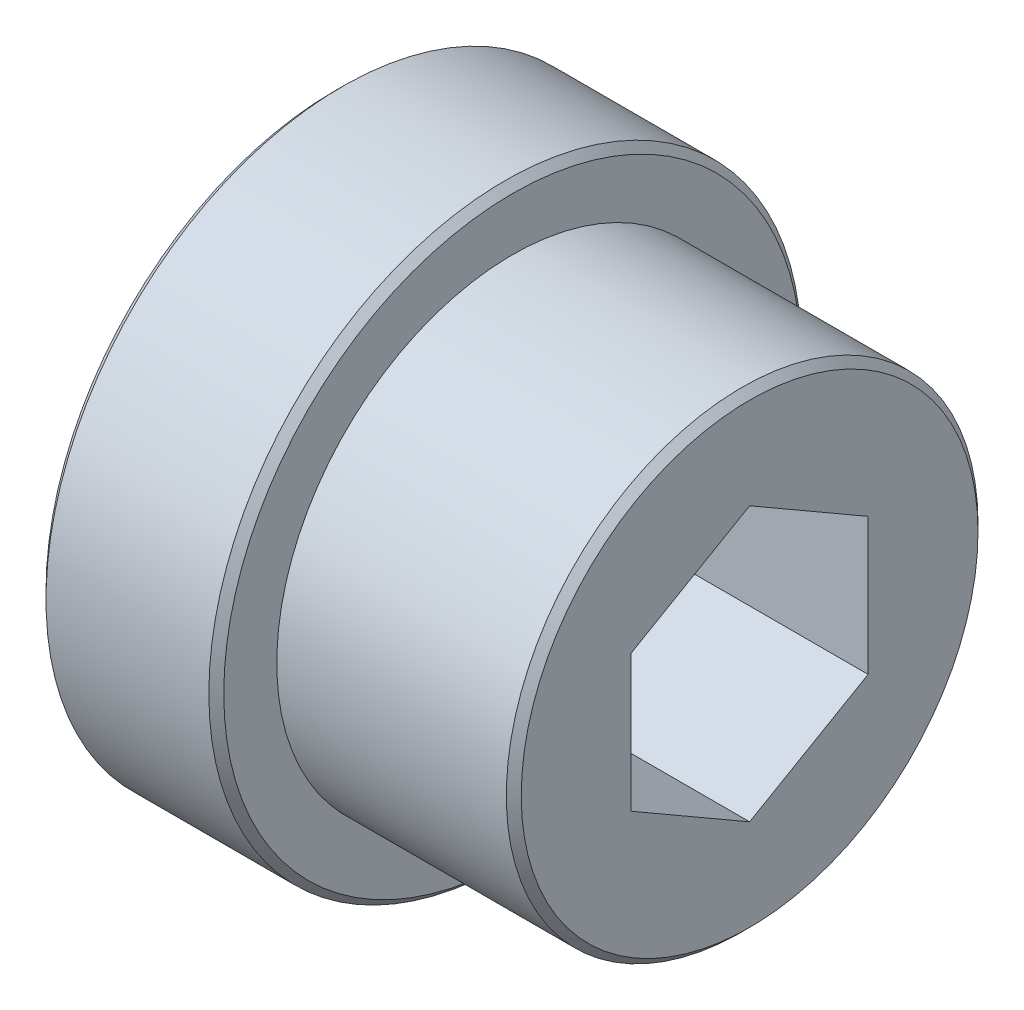
ISO-10303-21;
HEADER;
FILE_DESCRIPTION(('STEP AP214'),'2;1');
FILE_NAME('part.step','',(''),(''),'','','');
FILE_SCHEMA(('AUTOMOTIVE_DESIGN { 1 0 10303 214 1 1 1 1 }'));
ENDSEC;
DATA;
#1=APPLICATION_CONTEXT('core data for automotive mechanical design processes');
#2=APPLICATION_PROTOCOL_DEFINITION('international standard','automotive_design',2000,#1);
#3=PRODUCT_CONTEXT('',#1,'mechanical');
#4=PRODUCT('Part','Part','',(#3));
#5=PRODUCT_RELATED_PRODUCT_CATEGORY('part','',(#4));
#6=PRODUCT_DEFINITION_FORMATION('','',#4);
#7=PRODUCT_DEFINITION_CONTEXT('part definition',#1,'design');
#8=PRODUCT_DEFINITION('design','',#6,#7);
#9=PRODUCT_DEFINITION_SHAPE('','',#8);
#10=(LENGTH_UNIT() NAMED_UNIT(*) SI_UNIT(.MILLI.,.METRE.));
#11=(NAMED_UNIT(*) PLANE_ANGLE_UNIT() SI_UNIT($,.RADIAN.));
#12=(NAMED_UNIT(*) SI_UNIT($,.STERADIAN.) SOLID_ANGLE_UNIT());
#13=UNCERTAINTY_MEASURE_WITH_UNIT(LENGTH_MEASURE(1.E-05),#10,'distance_accuracy_value','');
#14=(GEOMETRIC_REPRESENTATION_CONTEXT(3) GLOBAL_UNCERTAINTY_ASSIGNED_CONTEXT((#13)) GLOBAL_UNIT_ASSIGNED_CONTEXT((#10,
#11,#12)) REPRESENTATION_CONTEXT('',''));
#15=CARTESIAN_POINT('',(0.,0.,0.));
#16=DIRECTION('',(0.,0.,1.));
#17=DIRECTION('',(1.,0.,0.));
#18=AXIS2_PLACEMENT_3D('',#15,#16,#17);
#19=CARTESIAN_POINT('',(12.7,0.,0.));
#20=DIRECTION('',(-1.,0.,0.));
#21=DIRECTION('',(0.,0.,1.));
#22=AXIS2_PLACEMENT_3D('',#19,#20,#21);
#23=CYLINDRICAL_SURFACE('',#22,12.6365);
#24=CARTESIAN_POINT('',(12.3,0.,0.));
#25=DIRECTION('',(1.,0.,0.));
#26=DIRECTION('',(0.,0.,-1.));
#27=AXIS2_PLACEMENT_3D('',#24,#25,#26);
#28=CIRCLE('',#27,12.6365);
#29=CARTESIAN_POINT('',(12.3,0.,-12.6365));
#30=VERTEX_POINT('',#29);
#31=EDGE_CURVE('E11',#30,#30,#28,.F.);
#32=ORIENTED_EDGE('',*,*,#31,.T.);
#33=EDGE_LOOP('',(#32));
#34=FACE_BOUND('',#33,.T.);
#35=CARTESIAN_POINT('',(0.,0.,0.));
#36=DIRECTION('',(1.,0.,0.));
#37=DIRECTION('',(0.,0.,-1.));
#38=AXIS2_PLACEMENT_3D('',#35,#36,#37);
#39=CIRCLE('',#38,12.6365);
#40=CARTESIAN_POINT('',(0.,0.,-12.6365));
#41=VERTEX_POINT('',#40);
#42=EDGE_CURVE('E138',#41,#41,#39,.T.);
#43=ORIENTED_EDGE('',*,*,#42,.T.);
#44=EDGE_LOOP('',(#43));
#45=FACE_BOUND('',#44,.T.);
#46=ADVANCED_FACE('F39',(#34,#45),#23,.T.);
#47=CARTESIAN_POINT('',(12.7,0.,0.));
#48=DIRECTION('',(1.,0.,0.));
#49=DIRECTION('',(0.,0.,-1.));
#50=AXIS2_PLACEMENT_3D('',#47,#48,#49);
#51=PLANE('',#50);
#52=DIRECTION('',(0.,0.5,-0.866025403784439));
#53=VECTOR('',#52,1.);
#54=CARTESIAN_POINT('',(12.7,3.66617420935413,6.34999999999999));
#55=LINE('',#54,#53);
#56=CARTESIAN_POINT('',(12.7,3.66617420935413,6.34999999999999));
#57=VERTEX_POINT('',#56);
#58=CARTESIAN_POINT('',(12.7,7.33234841870825,0.));
#59=VERTEX_POINT('',#58);
#60=EDGE_CURVE('E95',#57,#59,#55,.T.);
#61=ORIENTED_EDGE('',*,*,#60,.T.);
#62=DIRECTION('',(0.,-0.5,-0.866025403784438));
#63=VECTOR('',#62,1.);
#64=CARTESIAN_POINT('',(12.7,7.33234841870825,0.));
#65=LINE('',#64,#63);
#66=CARTESIAN_POINT('',(12.7,3.66617420935412,-6.35));
#67=VERTEX_POINT('',#66);
#68=EDGE_CURVE('E104',#59,#67,#65,.T.);
#69=ORIENTED_EDGE('',*,*,#68,.T.);
#70=DIRECTION('',(0.,-1.,0.));
#71=VECTOR('',#70,1.);
#72=CARTESIAN_POINT('',(12.7,3.66617420935412,-6.35));
#73=LINE('',#72,#71);
#74=CARTESIAN_POINT('',(12.7,-3.66617420935412,-6.35));
#75=VERTEX_POINT('',#74);
#76=EDGE_CURVE('E55',#67,#75,#73,.T.);
#77=ORIENTED_EDGE('',*,*,#76,.T.);
#78=DIRECTION('',(0.,-0.5,0.866025403784439));
#79=VECTOR('',#78,1.);
#80=CARTESIAN_POINT('',(12.7,-3.66617420935412,-6.35));
#81=LINE('',#80,#79);
#82=CARTESIAN_POINT('',(12.7,-7.33234841870824,0.));
#83=VERTEX_POINT('',#82);
#84=EDGE_CURVE('E119',#75,#83,#81,.T.);
#85=ORIENTED_EDGE('',*,*,#84,.T.);
#86=DIRECTION('',(0.,0.5,0.866025403784439));
#87=VECTOR('',#86,1.);
#88=CARTESIAN_POINT('',(12.7,-7.33234841870824,0.));
#89=LINE('',#88,#87);
#90=CARTESIAN_POINT('',(12.7,-3.66617420935412,6.35));
#91=VERTEX_POINT('',#90);
#92=EDGE_CURVE('E122',#83,#91,#89,.T.);
#93=ORIENTED_EDGE('',*,*,#92,.T.);
#94=DIRECTION('',(0.,1.,0.));
#95=VECTOR('',#94,1.);
#96=CARTESIAN_POINT('',(12.7,-3.66617420935412,6.35));
#97=LINE('',#96,#95);
#98=EDGE_CURVE('E101',#91,#57,#97,.T.);
#99=ORIENTED_EDGE('',*,*,#98,.T.);
#100=EDGE_LOOP('',(#61,#69,#77,#85,#93,#99));
#101=FACE_BOUND('',#100,.T.);
#102=CARTESIAN_POINT('',(12.7,0.,0.));
#103=DIRECTION('',(1.,0.,0.));
#104=DIRECTION('',(0.,0.,-1.));
#105=AXIS2_PLACEMENT_3D('',#102,#103,#104);
#106=CIRCLE('',#105,12.2365);
#107=CARTESIAN_POINT('',(12.7,0.,-12.2365));
#108=VERTEX_POINT('',#107);
#109=EDGE_CURVE('E48',#108,#108,#106,.T.);
#110=ORIENTED_EDGE('',*,*,#109,.T.);
#111=EDGE_LOOP('',(#110));
#112=FACE_BOUND('',#111,.T.);
#113=ADVANCED_FACE('F108',(#101,#112),#51,.T.);
#114=CARTESIAN_POINT('',(-9.525,0.,0.));
#115=DIRECTION('',(1.,0.,0.));
#116=DIRECTION('',(0.,0.,-1.));
#117=AXIS2_PLACEMENT_3D('',#114,#115,#116);
#118=CYLINDRICAL_SURFACE('',#117,15.875);
#119=CARTESIAN_POINT('',(-0.400000000000005,0.,0.));
#120=DIRECTION('',(-1.,0.,0.));
#121=DIRECTION('',(0.,0.,1.));
#122=AXIS2_PLACEMENT_3D('',#119,#120,#121);
#123=CIRCLE('',#122,15.875);
#124=CARTESIAN_POINT('',(-0.400000000000005,0.,-15.875));
#125=VERTEX_POINT('',#124);
#126=EDGE_CURVE('E151',#125,#125,#123,.T.);
#127=CARTESIAN_POINT('',(-9.12500000000002,0.,0.));
#128=DIRECTION('',(-1.,0.,0.));
#129=DIRECTION('',(0.,0.,1.));
#130=AXIS2_PLACEMENT_3D('',#127,#128,#129);
#131=CIRCLE('',#130,15.875);
#132=CARTESIAN_POINT('',(-9.12500000000002,0.,-15.875));
#133=VERTEX_POINT('',#132);
#134=EDGE_CURVE('E148',#133,#133,#131,.F.);
#135=CARTESIAN_POINT('',(-0.400000000000005,0.,-15.875));
#136=CARTESIAN_POINT('',(-0.490885416666671,0.,-15.875));
#137=CARTESIAN_POINT('',(-0.581770833333339,0.,-15.875));
#138=CARTESIAN_POINT('',(-0.763541666666672,0.,-15.875));
#139=CARTESIAN_POINT('',(-0.854427083333339,0.,-15.875));
#140=CARTESIAN_POINT('',(-1.03619791666667,0.,-15.875));
#141=CARTESIAN_POINT('',(-1.12708333333334,0.,-15.875));
#142=CARTESIAN_POINT('',(-1.30885416666667,0.,-15.875));
#143=CARTESIAN_POINT('',(-1.39973958333334,0.,-15.875));
#144=CARTESIAN_POINT('',(-1.58151041666667,0.,-15.875));
#145=CARTESIAN_POINT('',(-1.67239583333334,0.,-15.875));
#146=CARTESIAN_POINT('',(-1.85416666666667,0.,-15.875));
#147=CARTESIAN_POINT('',(-1.94505208333334,0.,-15.875));
#148=CARTESIAN_POINT('',(-2.12682291666667,0.,-15.875));
#149=CARTESIAN_POINT('',(-2.21770833333334,0.,-15.875));
#150=CARTESIAN_POINT('',(-2.39947916666667,0.,-15.875));
#151=CARTESIAN_POINT('',(-2.49036458333334,0.,-15.875));
#152=CARTESIAN_POINT('',(-2.67213541666667,0.,-15.875));
#153=CARTESIAN_POINT('',(-2.76302083333334,0.,-15.875));
#154=CARTESIAN_POINT('',(-2.94479166666668,0.,-15.875));
#155=CARTESIAN_POINT('',(-3.03567708333334,0.,-15.875));
#156=CARTESIAN_POINT('',(-3.21744791666668,0.,-15.875));
#157=CARTESIAN_POINT('',(-3.30833333333334,0.,-15.875));
#158=CARTESIAN_POINT('',(-3.49010416666668,0.,-15.875));
#159=CARTESIAN_POINT('',(-3.58098958333334,0.,-15.875));
#160=CARTESIAN_POINT('',(-3.76276041666668,0.,-15.875));
#161=CARTESIAN_POINT('',(-3.85364583333334,0.,-15.875));
#162=CARTESIAN_POINT('',(-4.03541666666668,0.,-15.875));
#163=CARTESIAN_POINT('',(-4.12630208333334,0.,-15.875));
#164=CARTESIAN_POINT('',(-4.30807291666668,0.,-15.875));
#165=CARTESIAN_POINT('',(-4.39895833333335,0.,-15.875));
#166=CARTESIAN_POINT('',(-4.58072916666668,0.,-15.875));
#167=CARTESIAN_POINT('',(-4.67161458333335,0.,-15.875));
#168=CARTESIAN_POINT('',(-4.85338541666668,0.,-15.875));
#169=CARTESIAN_POINT('',(-4.94427083333335,0.,-15.875));
#170=CARTESIAN_POINT('',(-5.12604166666668,0.,-15.875));
#171=CARTESIAN_POINT('',(-5.21692708333335,0.,-15.875));
#172=CARTESIAN_POINT('',(-5.39869791666668,0.,-15.875));
#173=CARTESIAN_POINT('',(-5.48958333333335,0.,-15.875));
#174=CARTESIAN_POINT('',(-5.67135416666668,0.,-15.875));
#175=CARTESIAN_POINT('',(-5.76223958333335,0.,-15.875));
#176=CARTESIAN_POINT('',(-5.94401041666668,0.,-15.875));
#177=CARTESIAN_POINT('',(-6.03489583333335,0.,-15.875));
#178=CARTESIAN_POINT('',(-6.21666666666668,0.,-15.875));
#179=CARTESIAN_POINT('',(-6.30755208333335,0.,-15.875));
#180=CARTESIAN_POINT('',(-6.48932291666668,0.,-15.875));
#181=CARTESIAN_POINT('',(-6.58020833333335,0.,-15.875));
#182=CARTESIAN_POINT('',(-6.76197916666668,0.,-15.875));
#183=CARTESIAN_POINT('',(-6.85286458333335,0.,-15.875));
#184=CARTESIAN_POINT('',(-7.03463541666668,0.,-15.875));
#185=CARTESIAN_POINT('',(-7.12552083333335,0.,-15.875));
#186=CARTESIAN_POINT('',(-7.30729166666668,0.,-15.875));
#187=CARTESIAN_POINT('',(-7.39817708333335,0.,-15.875));
#188=CARTESIAN_POINT('',(-7.57994791666668,0.,-15.875));
#189=CARTESIAN_POINT('',(-7.67083333333335,0.,-15.875));
#190=CARTESIAN_POINT('',(-7.85260416666668,0.,-15.875));
#191=CARTESIAN_POINT('',(-7.94348958333335,0.,-15.875));
#192=CARTESIAN_POINT('',(-8.12526041666669,0.,-15.875));
#193=CARTESIAN_POINT('',(-8.21614583333335,0.,-15.875));
#194=CARTESIAN_POINT('',(-8.39791666666668,0.,-15.875));
#195=CARTESIAN_POINT('',(-8.48880208333335,0.,-15.875));
#196=CARTESIAN_POINT('',(-8.67057291666669,0.,-15.875));
#197=CARTESIAN_POINT('',(-8.76145833333335,0.,-15.875));
#198=CARTESIAN_POINT('',(-8.94322916666669,0.,-15.875));
#199=CARTESIAN_POINT('',(-9.03411458333335,0.,-15.875));
#200=CARTESIAN_POINT('',(-9.12500000000002,0.,-15.875));
#201=B_SPLINE_CURVE_WITH_KNOTS('',3,(#135,#136,#137,#138,#139,#140,#141,#142,#143,#144,#145,
#146,#147,#148,#149,#150,#151,#152,#153,#154,#155,#156,#157,#158,#159,#160,#161,#162,#163,#164,
#165,#166,#167,#168,#169,#170,#171,#172,#173,#174,#175,#176,#177,#178,#179,#180,#181,#182,#183,
#184,#185,#186,#187,#188,#189,#190,#191,#192,#193,#194,#195,#196,#197,#198,#199,#200),
.UNSPECIFIED.,.F.,.F.,(4,2,2,2,2,2,2,2,2,2,2,2,2,2,2,2,2,2,2,2,2,2,2,2,2,2,2,2,2,2,2,2,4),(0.,
0.272656250000001,0.545312500000001,0.817968750000002,1.090625,1.36328125,1.6359375,1.90859375,
2.18125,2.45390625,2.7265625,2.99921875000001,3.27187500000001,3.54453125000001,
3.81718750000001,4.08984375000001,4.36250000000001,4.63515625000001,4.90781250000001,
5.18046875000001,5.45312500000001,5.72578125000001,5.99843750000001,6.27109375000001,
6.54375000000001,6.81640625000001,7.08906250000001,7.36171875000001,7.63437500000001,
7.90703125000001,8.17968750000001,8.45234375000001,8.72500000000002),.UNSPECIFIED.);
#202=EDGE_CURVE('BSEAM180',#125,#133,#201,.T.);
#203=ORIENTED_EDGE('',*,*,#126,.T.);
#204=ORIENTED_EDGE('',*,*,#134,.T.);
#205=ORIENTED_EDGE('',*,*,#202,.T.);
#206=ORIENTED_EDGE('',*,*,#202,.F.);
#207=EDGE_LOOP('',(#203,#205,#204,#206));
#208=FACE_BOUND('',#207,.T.);
#209=ADVANCED_FACE('F180',(#208),#118,.T.);
#210=CARTESIAN_POINT('',(-9.525,0.,0.));
#211=DIRECTION('',(-1.,0.,0.));
#212=DIRECTION('',(0.,0.,1.));
#213=AXIS2_PLACEMENT_3D('',#210,#211,#212);
#214=PLANE('',#213);
#215=DIRECTION('',(0.,0.5,-0.866025403784439));
#216=VECTOR('',#215,1.);
#217=CARTESIAN_POINT('',(-9.525,3.66617420935413,6.34999999999999));
#218=LINE('',#217,#216);
#219=CARTESIAN_POINT('',(-9.525,3.66617420935413,6.34999999999999));
#220=VERTEX_POINT('',#219);
#221=CARTESIAN_POINT('',(-9.525,7.33234841870825,0.));
#222=VERTEX_POINT('',#221);
#223=EDGE_CURVE('E63',#220,#222,#218,.T.);
#224=ORIENTED_EDGE('',*,*,#223,.F.);
#225=DIRECTION('',(0.,1.,0.));
#226=VECTOR('',#225,1.);
#227=CARTESIAN_POINT('',(-9.525,-3.66617420935412,6.35));
#228=LINE('',#227,#226);
#229=CARTESIAN_POINT('',(-9.525,-3.66617420935412,6.35));
#230=VERTEX_POINT('',#229);
#231=EDGE_CURVE('E112',#230,#220,#228,.T.);
#232=ORIENTED_EDGE('',*,*,#231,.F.);
#233=DIRECTION('',(0.,0.5,0.866025403784439));
#234=VECTOR('',#233,1.);
#235=CARTESIAN_POINT('',(-9.525,-7.33234841870824,0.));
#236=LINE('',#235,#234);
#237=CARTESIAN_POINT('',(-9.525,-7.33234841870824,0.));
#238=VERTEX_POINT('',#237);
#239=EDGE_CURVE('E115',#238,#230,#236,.T.);
#240=ORIENTED_EDGE('',*,*,#239,.F.);
#241=DIRECTION('',(0.,-0.5,0.866025403784439));
#242=VECTOR('',#241,1.);
#243=CARTESIAN_POINT('',(-9.525,-3.66617420935412,-6.35));
#244=LINE('',#243,#242);
#245=CARTESIAN_POINT('',(-9.525,-3.66617420935412,-6.35));
#246=VERTEX_POINT('',#245);
#247=EDGE_CURVE('E131',#246,#238,#244,.T.);
#248=ORIENTED_EDGE('',*,*,#247,.F.);
#249=DIRECTION('',(0.,-1.,0.));
#250=VECTOR('',#249,1.);
#251=CARTESIAN_POINT('',(-9.525,3.66617420935412,-6.35));
#252=LINE('',#251,#250);
#253=CARTESIAN_POINT('',(-9.525,3.66617420935412,-6.35));
#254=VERTEX_POINT('',#253);
#255=EDGE_CURVE('E128',#254,#246,#252,.T.);
#256=ORIENTED_EDGE('',*,*,#255,.F.);
#257=DIRECTION('',(0.,-0.5,-0.866025403784438));
#258=VECTOR('',#257,1.);
#259=CARTESIAN_POINT('',(-9.525,7.33234841870825,0.));
#260=LINE('',#259,#258);
#261=EDGE_CURVE('E126',#222,#254,#260,.T.);
#262=ORIENTED_EDGE('',*,*,#261,.F.);
#263=EDGE_LOOP('',(#224,#232,#240,#248,#256,#262));
#264=FACE_BOUND('',#263,.T.);
#265=CARTESIAN_POINT('',(-9.525,0.,0.));
#266=DIRECTION('',(-1.,0.,0.));
#267=DIRECTION('',(0.,0.,1.));
#268=AXIS2_PLACEMENT_3D('',#265,#266,#267);
#269=CIRCLE('',#268,15.475);
#270=CARTESIAN_POINT('',(-9.525,0.,15.475));
#271=VERTEX_POINT('',#270);
#272=EDGE_CURVE('E157',#271,#271,#269,.T.);
#273=ORIENTED_EDGE('',*,*,#272,.T.);
#274=EDGE_LOOP('',(#273));
#275=FACE_BOUND('',#274,.T.);
#276=ADVANCED_FACE('F199',(#264,#275),#214,.T.);
#277=CARTESIAN_POINT('',(0.,0.,0.));
#278=DIRECTION('',(-1.,0.,0.));
#279=DIRECTION('',(0.,0.,1.));
#280=AXIS2_PLACEMENT_3D('',#277,#278,#279);
#281=PLANE('',#280);
#282=CARTESIAN_POINT('',(0.,0.,0.));
#283=DIRECTION('',(-1.,0.,0.));
#284=DIRECTION('',(0.,0.,1.));
#285=AXIS2_PLACEMENT_3D('',#282,#283,#284);
#286=CIRCLE('',#285,15.475);
#287=CARTESIAN_POINT('',(0.,0.,15.475));
#288=VERTEX_POINT('',#287);
#289=EDGE_CURVE('E154',#288,#288,#286,.F.);
#290=ORIENTED_EDGE('',*,*,#289,.T.);
#291=EDGE_LOOP('',(#290));
#292=FACE_BOUND('',#291,.T.);
#293=ORIENTED_EDGE('',*,*,#42,.F.);
#294=EDGE_LOOP('',(#293));
#295=FACE_BOUND('',#294,.T.);
#296=ADVANCED_FACE('F190',(#292,#295),#281,.F.);
#297=CARTESIAN_POINT('',(-0.400000000000005,0.,0.));
#298=DIRECTION('',(-1.,0.,0.));
#299=DIRECTION('',(0.,0.,1.));
#300=AXIS2_PLACEMENT_3D('',#297,#298,#299);
#301=CONICAL_SURFACE('',#300,15.875,0.785398163397444);
#302=ORIENTED_EDGE('',*,*,#289,.F.);
#303=EDGE_LOOP('',(#302));
#304=FACE_BOUND('',#303,.T.);
#305=ORIENTED_EDGE('',*,*,#126,.F.);
#306=EDGE_LOOP('',(#305));
#307=FACE_BOUND('',#306,.T.);
#308=ADVANCED_FACE('F171',(#304,#307),#301,.T.);
#309=CARTESIAN_POINT('',(-9.525,0.,0.));
#310=DIRECTION('',(1.,0.,0.));
#311=DIRECTION('',(0.,0.,-1.));
#312=AXIS2_PLACEMENT_3D('',#309,#310,#311);
#313=CONICAL_SURFACE('',#312,15.475,0.785398163397444);
#314=ORIENTED_EDGE('',*,*,#134,.F.);
#315=EDGE_LOOP('',(#314));
#316=FACE_BOUND('',#315,.T.);
#317=ORIENTED_EDGE('',*,*,#272,.F.);
#318=EDGE_LOOP('',(#317));
#319=FACE_BOUND('',#318,.T.);
#320=ADVANCED_FACE('F163',(#316,#319),#313,.T.);
#321=CARTESIAN_POINT('',(12.7,0.,0.));
#322=DIRECTION('',(-1.,0.,0.));
#323=DIRECTION('',(0.,0.,1.));
#324=AXIS2_PLACEMENT_3D('',#321,#322,#323);
#325=CONICAL_SURFACE('',#324,12.2365,0.78539816339745);
#326=ORIENTED_EDGE('',*,*,#31,.F.);
#327=EDGE_LOOP('',(#326));
#328=FACE_BOUND('',#327,.T.);
#329=ORIENTED_EDGE('',*,*,#109,.F.);
#330=EDGE_LOOP('',(#329));
#331=FACE_BOUND('',#330,.T.);
#332=ADVANCED_FACE('F42',(#328,#331),#325,.T.);
#333=CARTESIAN_POINT('',(12.7,3.66617420935413,6.34999999999999));
#334=DIRECTION('',(0.,0.866025403784439,0.5));
#335=DIRECTION('',(0.,-0.5,0.866025403784439));
#336=AXIS2_PLACEMENT_3D('',#333,#334,#335);
#337=PLANE('',#336);
#338=ORIENTED_EDGE('',*,*,#223,.T.);
#339=DIRECTION('',(-1.,0.,0.));
#340=VECTOR('',#339,1.);
#341=CARTESIAN_POINT('',(12.7,7.33234841870825,0.));
#342=LINE('',#341,#340);
#343=EDGE_CURVE('E91',#59,#222,#342,.T.);
#344=ORIENTED_EDGE('',*,*,#343,.F.);
#345=ORIENTED_EDGE('',*,*,#60,.F.);
#346=DIRECTION('',(-1.,0.,0.));
#347=VECTOR('',#346,1.);
#348=CARTESIAN_POINT('',(12.7,3.66617420935413,6.34999999999999));
#349=LINE('',#348,#347);
#350=EDGE_CURVE('E136',#57,#220,#349,.T.);
#351=ORIENTED_EDGE('',*,*,#350,.T.);
#352=EDGE_LOOP('',(#338,#344,#345,#351));
#353=FACE_BOUND('',#352,.T.);
#354=ADVANCED_FACE('F93',(#353),#337,.F.);
#355=CARTESIAN_POINT('',(12.7,-3.66617420935412,6.35));
#356=DIRECTION('',(0.,0.,1.));
#357=DIRECTION('',(0.,-1.,0.));
#358=AXIS2_PLACEMENT_3D('',#355,#356,#357);
#359=PLANE('',#358);
#360=ORIENTED_EDGE('',*,*,#231,.T.);
#361=ORIENTED_EDGE('',*,*,#350,.F.);
#362=ORIENTED_EDGE('',*,*,#98,.F.);
#363=DIRECTION('',(-1.,0.,0.));
#364=VECTOR('',#363,1.);
#365=CARTESIAN_POINT('',(12.7,-3.66617420935412,6.35));
#366=LINE('',#365,#364);
#367=EDGE_CURVE('E139',#91,#230,#366,.T.);
#368=ORIENTED_EDGE('',*,*,#367,.T.);
#369=EDGE_LOOP('',(#360,#361,#362,#368));
#370=FACE_BOUND('',#369,.T.);
#371=ADVANCED_FACE('F169',(#370),#359,.F.);
#372=CARTESIAN_POINT('',(12.7,-7.33234841870824,0.));
#373=DIRECTION('',(0.,-0.866025403784438,0.5));
#374=DIRECTION('',(0.,-0.5,-0.866025403784439));
#375=AXIS2_PLACEMENT_3D('',#372,#373,#374);
#376=PLANE('',#375);
#377=ORIENTED_EDGE('',*,*,#239,.T.);
#378=ORIENTED_EDGE('',*,*,#367,.F.);
#379=ORIENTED_EDGE('',*,*,#92,.F.);
#380=DIRECTION('',(-1.,0.,0.));
#381=VECTOR('',#380,1.);
#382=CARTESIAN_POINT('',(12.7,-7.33234841870824,0.));
#383=LINE('',#382,#381);
#384=EDGE_CURVE('E141',#83,#238,#383,.T.);
#385=ORIENTED_EDGE('',*,*,#384,.T.);
#386=EDGE_LOOP('',(#377,#378,#379,#385));
#387=FACE_BOUND('',#386,.T.);
#388=ADVANCED_FACE('F226',(#387),#376,.F.);
#389=CARTESIAN_POINT('',(12.7,-3.66617420935412,-6.35));
#390=DIRECTION('',(0.,-0.866025403784439,-0.5));
#391=DIRECTION('',(0.,0.5,-0.866025403784439));
#392=AXIS2_PLACEMENT_3D('',#389,#390,#391);
#393=PLANE('',#392);
#394=ORIENTED_EDGE('',*,*,#247,.T.);
#395=ORIENTED_EDGE('',*,*,#384,.F.);
#396=ORIENTED_EDGE('',*,*,#84,.F.);
#397=DIRECTION('',(-1.,0.,0.));
#398=VECTOR('',#397,1.);
#399=CARTESIAN_POINT('',(12.7,-3.66617420935412,-6.35));
#400=LINE('',#399,#398);
#401=EDGE_CURVE('E143',#75,#246,#400,.T.);
#402=ORIENTED_EDGE('',*,*,#401,.T.);
#403=EDGE_LOOP('',(#394,#395,#396,#402));
#404=FACE_BOUND('',#403,.T.);
#405=ADVANCED_FACE('F223',(#404),#393,.F.);
#406=CARTESIAN_POINT('',(12.7,3.66617420935412,-6.35));
#407=DIRECTION('',(0.,0.,-1.));
#408=DIRECTION('',(0.,1.,0.));
#409=AXIS2_PLACEMENT_3D('',#406,#407,#408);
#410=PLANE('',#409);
#411=ORIENTED_EDGE('',*,*,#255,.T.);
#412=ORIENTED_EDGE('',*,*,#401,.F.);
#413=ORIENTED_EDGE('',*,*,#76,.F.);
#414=DIRECTION('',(-1.,0.,0.));
#415=VECTOR('',#414,1.);
#416=CARTESIAN_POINT('',(12.7,3.66617420935412,-6.35));
#417=LINE('',#416,#415);
#418=EDGE_CURVE('E100',#67,#254,#417,.T.);
#419=ORIENTED_EDGE('',*,*,#418,.T.);
#420=EDGE_LOOP('',(#411,#412,#413,#419));
#421=FACE_BOUND('',#420,.T.);
#422=ADVANCED_FACE('F220',(#421),#410,.F.);
#423=CARTESIAN_POINT('',(12.7,7.33234841870825,0.));
#424=DIRECTION('',(0.,0.866025403784438,-0.5));
#425=DIRECTION('',(0.,0.5,0.866025403784439));
#426=AXIS2_PLACEMENT_3D('',#423,#424,#425);
#427=PLANE('',#426);
#428=ORIENTED_EDGE('',*,*,#261,.T.);
#429=ORIENTED_EDGE('',*,*,#418,.F.);
#430=ORIENTED_EDGE('',*,*,#68,.F.);
#431=ORIENTED_EDGE('',*,*,#343,.T.);
#432=EDGE_LOOP('',(#428,#429,#430,#431));
#433=FACE_BOUND('',#432,.T.);
#434=ADVANCED_FACE('F105',(#433),#427,.F.);
#435=CLOSED_SHELL('',(#46,#113,#209,#276,#296,#308,#320,#332,#354,#371,#388,#405,#422,#434));
#436=MANIFOLD_SOLID_BREP('B2',#435);
#437=ADVANCED_BREP_SHAPE_REPRESENTATION('',(#18,#436),#14);
#438=SHAPE_DEFINITION_REPRESENTATION(#9,#437);
ENDSEC;
END-ISO-10303-21;
